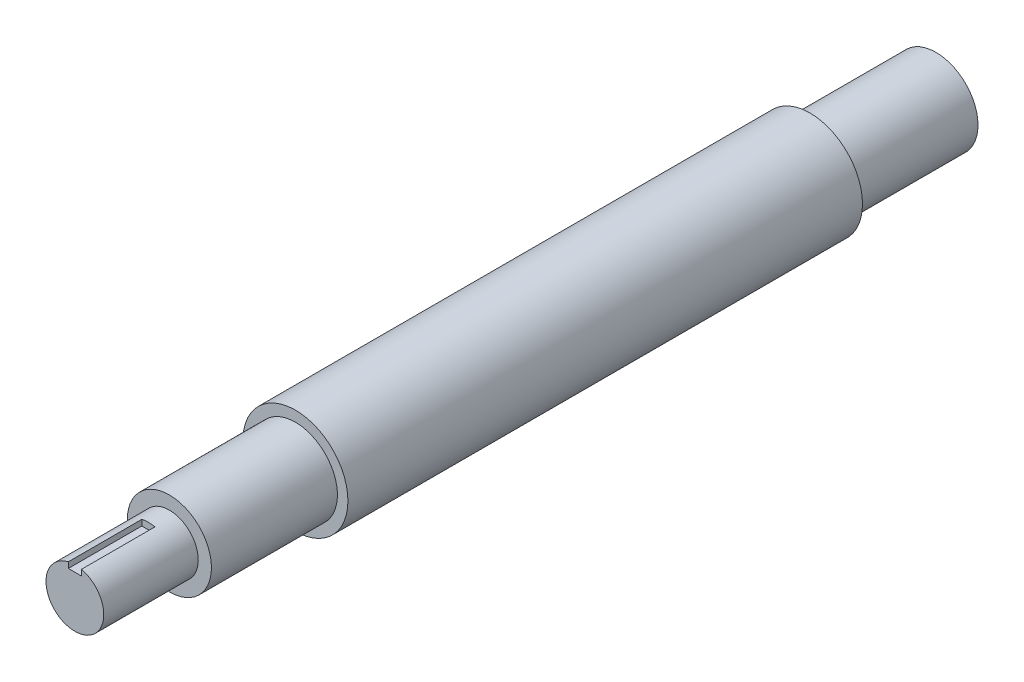
ISO-10303-21;
HEADER;
FILE_DESCRIPTION(('STEP AP214'),'2;1');
FILE_NAME('part.step','',(''),(''),'','','');
FILE_SCHEMA(('AUTOMOTIVE_DESIGN { 1 0 10303 214 1 1 1 1 }'));
ENDSEC;
DATA;
#1=APPLICATION_CONTEXT('core data for automotive mechanical design processes');
#2=APPLICATION_PROTOCOL_DEFINITION('international standard','automotive_design',2000,#1);
#3=PRODUCT_CONTEXT('',#1,'mechanical');
#4=PRODUCT('Part','Part','',(#3));
#5=PRODUCT_RELATED_PRODUCT_CATEGORY('part','',(#4));
#6=PRODUCT_DEFINITION_FORMATION('','',#4);
#7=PRODUCT_DEFINITION_CONTEXT('part definition',#1,'design');
#8=PRODUCT_DEFINITION('design','',#6,#7);
#9=PRODUCT_DEFINITION_SHAPE('','',#8);
#10=(LENGTH_UNIT() NAMED_UNIT(*) SI_UNIT(.MILLI.,.METRE.));
#11=(NAMED_UNIT(*) PLANE_ANGLE_UNIT() SI_UNIT($,.RADIAN.));
#12=(NAMED_UNIT(*) SI_UNIT($,.STERADIAN.) SOLID_ANGLE_UNIT());
#13=UNCERTAINTY_MEASURE_WITH_UNIT(LENGTH_MEASURE(1.E-05),#10,'distance_accuracy_value','');
#14=(GEOMETRIC_REPRESENTATION_CONTEXT(3) GLOBAL_UNCERTAINTY_ASSIGNED_CONTEXT((#13)) GLOBAL_UNIT_ASSIGNED_CONTEXT((#10,
#11,#12)) REPRESENTATION_CONTEXT('',''));
#15=CARTESIAN_POINT('',(0.,0.,0.));
#16=DIRECTION('',(0.,0.,1.));
#17=DIRECTION('',(1.,0.,0.));
#18=AXIS2_PLACEMENT_3D('',#15,#16,#17);
#19=CARTESIAN_POINT('',(0.,0.,155.575));
#20=DIRECTION('',(0.,0.,-1.));
#21=DIRECTION('',(-1.,0.,0.));
#22=AXIS2_PLACEMENT_3D('',#19,#20,#21);
#23=CYLINDRICAL_SURFACE('',#22,31.75);
#24=CARTESIAN_POINT('',(0.,0.,155.575));
#25=DIRECTION('',(0.,0.,1.));
#26=DIRECTION('',(1.,0.,0.));
#27=AXIS2_PLACEMENT_3D('',#24,#25,#26);
#28=CIRCLE('',#27,31.75);
#29=CARTESIAN_POINT('',(31.75,0.,155.575));
#30=VERTEX_POINT('',#29);
#31=EDGE_CURVE('E121',#30,#30,#28,.T.);
#32=ORIENTED_EDGE('',*,*,#31,.F.);
#33=EDGE_LOOP('',(#32));
#34=FACE_BOUND('',#33,.T.);
#35=CARTESIAN_POINT('',(0.,0.,-155.575));
#36=DIRECTION('',(0.,0.,1.));
#37=DIRECTION('',(1.,0.,0.));
#38=AXIS2_PLACEMENT_3D('',#35,#36,#37);
#39=CIRCLE('',#38,31.75);
#40=CARTESIAN_POINT('',(31.75,0.,-155.575));
#41=VERTEX_POINT('',#40);
#42=EDGE_CURVE('E118',#41,#41,#39,.T.);
#43=ORIENTED_EDGE('',*,*,#42,.T.);
#44=EDGE_LOOP('',(#43));
#45=FACE_BOUND('',#44,.T.);
#46=ADVANCED_FACE('F35',(#34,#45),#23,.T.);
#47=CARTESIAN_POINT('',(0.,0.,155.575));
#48=DIRECTION('',(0.,0.,1.));
#49=DIRECTION('',(1.,0.,0.));
#50=AXIS2_PLACEMENT_3D('',#47,#48,#49);
#51=PLANE('',#50);
#52=CARTESIAN_POINT('',(0.,0.,155.575));
#53=DIRECTION('',(0.,0.,1.));
#54=DIRECTION('',(1.,0.,0.));
#55=AXIS2_PLACEMENT_3D('',#52,#53,#54);
#56=CIRCLE('',#55,25.4);
#57=CARTESIAN_POINT('',(-25.4,0.,155.575));
#58=VERTEX_POINT('',#57);
#59=EDGE_CURVE('E115',#58,#58,#56,.T.);
#60=ORIENTED_EDGE('',*,*,#59,.F.);
#61=EDGE_LOOP('',(#60));
#62=FACE_BOUND('',#61,.T.);
#63=ORIENTED_EDGE('',*,*,#31,.T.);
#64=EDGE_LOOP('',(#63));
#65=FACE_BOUND('',#64,.T.);
#66=ADVANCED_FACE('F131',(#62,#65),#51,.T.);
#67=CARTESIAN_POINT('',(0.,0.,-155.575));
#68=DIRECTION('',(0.,0.,1.));
#69=DIRECTION('',(1.,0.,0.));
#70=AXIS2_PLACEMENT_3D('',#67,#68,#69);
#71=PLANE('',#70);
#72=CARTESIAN_POINT('',(0.,0.,-155.575));
#73=DIRECTION('',(0.,0.,-1.));
#74=DIRECTION('',(-1.,0.,0.));
#75=AXIS2_PLACEMENT_3D('',#72,#73,#74);
#76=CIRCLE('',#75,25.4);
#77=CARTESIAN_POINT('',(25.4,0.,-155.575));
#78=VERTEX_POINT('',#77);
#79=EDGE_CURVE('E109',#78,#78,#76,.T.);
#80=ORIENTED_EDGE('',*,*,#79,.F.);
#81=EDGE_LOOP('',(#80));
#82=FACE_BOUND('',#81,.T.);
#83=ORIENTED_EDGE('',*,*,#42,.F.);
#84=EDGE_LOOP('',(#83));
#85=FACE_BOUND('',#84,.T.);
#86=ADVANCED_FACE('F128',(#82,#85),#71,.F.);
#87=CARTESIAN_POINT('',(0.,0.,231.775));
#88=DIRECTION('',(0.,0.,-1.));
#89=DIRECTION('',(-1.,0.,0.));
#90=AXIS2_PLACEMENT_3D('',#87,#88,#89);
#91=CYLINDRICAL_SURFACE('',#90,25.4);
#92=CARTESIAN_POINT('',(0.,0.,231.775));
#93=DIRECTION('',(0.,0.,1.));
#94=DIRECTION('',(1.,0.,0.));
#95=AXIS2_PLACEMENT_3D('',#92,#93,#94);
#96=CIRCLE('',#95,25.4);
#97=CARTESIAN_POINT('',(-25.4,0.,231.775));
#98=VERTEX_POINT('',#97);
#99=EDGE_CURVE('E112',#98,#98,#96,.T.);
#100=CARTESIAN_POINT('',(-25.4,0.,231.775));
#101=CARTESIAN_POINT('',(-25.4,0.,230.98125));
#102=CARTESIAN_POINT('',(-25.4,0.,230.1875));
#103=CARTESIAN_POINT('',(-25.4,0.,228.6));
#104=CARTESIAN_POINT('',(-25.4,0.,227.80625));
#105=CARTESIAN_POINT('',(-25.4,0.,226.21875));
#106=CARTESIAN_POINT('',(-25.4,0.,225.425));
#107=CARTESIAN_POINT('',(-25.4,0.,223.8375));
#108=CARTESIAN_POINT('',(-25.4,0.,223.04375));
#109=CARTESIAN_POINT('',(-25.4,0.,221.45625));
#110=CARTESIAN_POINT('',(-25.4,0.,220.6625));
#111=CARTESIAN_POINT('',(-25.4,0.,219.075));
#112=CARTESIAN_POINT('',(-25.4,0.,218.28125));
#113=CARTESIAN_POINT('',(-25.4,0.,216.69375));
#114=CARTESIAN_POINT('',(-25.4,0.,215.9));
#115=CARTESIAN_POINT('',(-25.4,0.,214.3125));
#116=CARTESIAN_POINT('',(-25.4,0.,213.51875));
#117=CARTESIAN_POINT('',(-25.4,0.,211.93125));
#118=CARTESIAN_POINT('',(-25.4,0.,211.1375));
#119=CARTESIAN_POINT('',(-25.4,0.,209.55));
#120=CARTESIAN_POINT('',(-25.4,0.,208.75625));
#121=CARTESIAN_POINT('',(-25.4,0.,207.16875));
#122=CARTESIAN_POINT('',(-25.4,0.,206.375));
#123=CARTESIAN_POINT('',(-25.4,0.,204.7875));
#124=CARTESIAN_POINT('',(-25.4,0.,203.99375));
#125=CARTESIAN_POINT('',(-25.4,0.,202.40625));
#126=CARTESIAN_POINT('',(-25.4,0.,201.6125));
#127=CARTESIAN_POINT('',(-25.4,0.,200.025));
#128=CARTESIAN_POINT('',(-25.4,0.,199.23125));
#129=CARTESIAN_POINT('',(-25.4,0.,197.64375));
#130=CARTESIAN_POINT('',(-25.4,0.,196.85));
#131=CARTESIAN_POINT('',(-25.4,0.,195.2625));
#132=CARTESIAN_POINT('',(-25.4,0.,194.46875));
#133=CARTESIAN_POINT('',(-25.4,0.,192.88125));
#134=CARTESIAN_POINT('',(-25.4,0.,192.0875));
#135=CARTESIAN_POINT('',(-25.4,0.,190.5));
#136=CARTESIAN_POINT('',(-25.4,0.,189.70625));
#137=CARTESIAN_POINT('',(-25.4,0.,188.11875));
#138=CARTESIAN_POINT('',(-25.4,0.,187.325));
#139=CARTESIAN_POINT('',(-25.4,0.,185.7375));
#140=CARTESIAN_POINT('',(-25.4,0.,184.94375));
#141=CARTESIAN_POINT('',(-25.4,0.,183.35625));
#142=CARTESIAN_POINT('',(-25.4,0.,182.5625));
#143=CARTESIAN_POINT('',(-25.4,0.,180.975));
#144=CARTESIAN_POINT('',(-25.4,0.,180.18125));
#145=CARTESIAN_POINT('',(-25.4,0.,178.59375));
#146=CARTESIAN_POINT('',(-25.4,0.,177.8));
#147=CARTESIAN_POINT('',(-25.4,0.,176.2125));
#148=CARTESIAN_POINT('',(-25.4,0.,175.41875));
#149=CARTESIAN_POINT('',(-25.4,0.,173.83125));
#150=CARTESIAN_POINT('',(-25.4,0.,173.0375));
#151=CARTESIAN_POINT('',(-25.4,0.,171.45));
#152=CARTESIAN_POINT('',(-25.4,0.,170.65625));
#153=CARTESIAN_POINT('',(-25.4,0.,169.06875));
#154=CARTESIAN_POINT('',(-25.4,0.,168.275));
#155=CARTESIAN_POINT('',(-25.4,0.,166.6875));
#156=CARTESIAN_POINT('',(-25.4,0.,165.89375));
#157=CARTESIAN_POINT('',(-25.4,0.,164.30625));
#158=CARTESIAN_POINT('',(-25.4,0.,163.5125));
#159=CARTESIAN_POINT('',(-25.4,0.,161.925));
#160=CARTESIAN_POINT('',(-25.4,0.,161.13125));
#161=CARTESIAN_POINT('',(-25.4,0.,159.54375));
#162=CARTESIAN_POINT('',(-25.4,0.,158.75));
#163=CARTESIAN_POINT('',(-25.4,0.,157.1625));
#164=CARTESIAN_POINT('',(-25.4,0.,156.36875));
#165=CARTESIAN_POINT('',(-25.4,0.,155.575));
#166=B_SPLINE_CURVE_WITH_KNOTS('',3,(#100,#101,#102,#103,#104,#105,#106,#107,#108,#109,#110,
#111,#112,#113,#114,#115,#116,#117,#118,#119,#120,#121,#122,#123,#124,#125,#126,#127,#128,#129,
#130,#131,#132,#133,#134,#135,#136,#137,#138,#139,#140,#141,#142,#143,#144,#145,#146,#147,#148,
#149,#150,#151,#152,#153,#154,#155,#156,#157,#158,#159,#160,#161,#162,#163,#164,#165),
.UNSPECIFIED.,.F.,.F.,(4,2,2,2,2,2,2,2,2,2,2,2,2,2,2,2,2,2,2,2,2,2,2,2,2,2,2,2,2,2,2,2,4),(0.,
2.38124999999997,4.76249999999998,7.14374999999998,9.52499999999998,11.90625,14.2875,16.66875,
19.05,21.43125,23.8125,26.19375,28.575,30.95625,33.3375,35.71875,38.1,40.48125,42.8625,45.24375,
47.625,50.00625,52.3875,54.76875,57.15,59.53125,61.9125,64.29375,66.675,69.05625,71.4375,
73.81875,76.2),.UNSPECIFIED.);
#167=EDGE_CURVE('BSEAM130',#98,#58,#166,.T.);
#168=ORIENTED_EDGE('',*,*,#99,.F.);
#169=ORIENTED_EDGE('',*,*,#59,.T.);
#170=ORIENTED_EDGE('',*,*,#167,.T.);
#171=ORIENTED_EDGE('',*,*,#167,.F.);
#172=EDGE_LOOP('',(#168,#170,#169,#171));
#173=FACE_BOUND('',#172,.T.);
#174=ADVANCED_FACE('F130',(#173),#91,.T.);
#175=CARTESIAN_POINT('',(0.,0.,231.775));
#176=DIRECTION('',(0.,0.,1.));
#177=DIRECTION('',(1.,0.,0.));
#178=AXIS2_PLACEMENT_3D('',#175,#176,#177);
#179=PLANE('',#178);
#180=CARTESIAN_POINT('',(0.,0.,231.775));
#181=DIRECTION('',(0.,0.,1.));
#182=DIRECTION('',(1.,0.,0.));
#183=AXIS2_PLACEMENT_3D('',#180,#181,#182);
#184=CIRCLE('',#183,17.4625);
#185=CARTESIAN_POINT('',(17.4625,0.,231.775));
#186=VERTEX_POINT('',#185);
#187=EDGE_CURVE('E106',#186,#186,#184,.T.);
#188=ORIENTED_EDGE('',*,*,#187,.F.);
#189=EDGE_LOOP('',(#188));
#190=FACE_BOUND('',#189,.T.);
#191=ORIENTED_EDGE('',*,*,#99,.T.);
#192=EDGE_LOOP('',(#191));
#193=FACE_BOUND('',#192,.T.);
#194=ADVANCED_FACE('F137',(#190,#193),#179,.T.);
#195=CARTESIAN_POINT('',(0.,0.,-231.775));
#196=DIRECTION('',(0.,0.,1.));
#197=DIRECTION('',(1.,0.,0.));
#198=AXIS2_PLACEMENT_3D('',#195,#196,#197);
#199=CYLINDRICAL_SURFACE('',#198,25.4);
#200=CARTESIAN_POINT('',(0.,0.,-231.775));
#201=DIRECTION('',(0.,0.,-1.));
#202=DIRECTION('',(-1.,0.,0.));
#203=AXIS2_PLACEMENT_3D('',#200,#201,#202);
#204=CIRCLE('',#203,25.4);
#205=CARTESIAN_POINT('',(25.4,0.,-231.775));
#206=VERTEX_POINT('',#205);
#207=EDGE_CURVE('E105',#206,#206,#204,.T.);
#208=CARTESIAN_POINT('',(25.4,0.,-231.775));
#209=CARTESIAN_POINT('',(25.4,0.,-230.98125));
#210=CARTESIAN_POINT('',(25.4,0.,-230.1875));
#211=CARTESIAN_POINT('',(25.4,0.,-228.6));
#212=CARTESIAN_POINT('',(25.4,0.,-227.80625));
#213=CARTESIAN_POINT('',(25.4,0.,-226.21875));
#214=CARTESIAN_POINT('',(25.4,0.,-225.425));
#215=CARTESIAN_POINT('',(25.4,0.,-223.8375));
#216=CARTESIAN_POINT('',(25.4,0.,-223.04375));
#217=CARTESIAN_POINT('',(25.4,0.,-221.45625));
#218=CARTESIAN_POINT('',(25.4,0.,-220.6625));
#219=CARTESIAN_POINT('',(25.4,0.,-219.075));
#220=CARTESIAN_POINT('',(25.4,0.,-218.28125));
#221=CARTESIAN_POINT('',(25.4,0.,-216.69375));
#222=CARTESIAN_POINT('',(25.4,0.,-215.9));
#223=CARTESIAN_POINT('',(25.4,0.,-214.3125));
#224=CARTESIAN_POINT('',(25.4,0.,-213.51875));
#225=CARTESIAN_POINT('',(25.4,0.,-211.93125));
#226=CARTESIAN_POINT('',(25.4,0.,-211.1375));
#227=CARTESIAN_POINT('',(25.4,0.,-209.55));
#228=CARTESIAN_POINT('',(25.4,0.,-208.75625));
#229=CARTESIAN_POINT('',(25.4,0.,-207.16875));
#230=CARTESIAN_POINT('',(25.4,0.,-206.375));
#231=CARTESIAN_POINT('',(25.4,0.,-204.7875));
#232=CARTESIAN_POINT('',(25.4,0.,-203.99375));
#233=CARTESIAN_POINT('',(25.4,0.,-202.40625));
#234=CARTESIAN_POINT('',(25.4,0.,-201.6125));
#235=CARTESIAN_POINT('',(25.4,0.,-200.025));
#236=CARTESIAN_POINT('',(25.4,0.,-199.23125));
#237=CARTESIAN_POINT('',(25.4,0.,-197.64375));
#238=CARTESIAN_POINT('',(25.4,0.,-196.85));
#239=CARTESIAN_POINT('',(25.4,0.,-195.2625));
#240=CARTESIAN_POINT('',(25.4,0.,-194.46875));
#241=CARTESIAN_POINT('',(25.4,0.,-192.88125));
#242=CARTESIAN_POINT('',(25.4,0.,-192.0875));
#243=CARTESIAN_POINT('',(25.4,0.,-190.5));
#244=CARTESIAN_POINT('',(25.4,0.,-189.70625));
#245=CARTESIAN_POINT('',(25.4,0.,-188.11875));
#246=CARTESIAN_POINT('',(25.4,0.,-187.325));
#247=CARTESIAN_POINT('',(25.4,0.,-185.7375));
#248=CARTESIAN_POINT('',(25.4,0.,-184.94375));
#249=CARTESIAN_POINT('',(25.4,0.,-183.35625));
#250=CARTESIAN_POINT('',(25.4,0.,-182.5625));
#251=CARTESIAN_POINT('',(25.4,0.,-180.975));
#252=CARTESIAN_POINT('',(25.4,0.,-180.18125));
#253=CARTESIAN_POINT('',(25.4,0.,-178.59375));
#254=CARTESIAN_POINT('',(25.4,0.,-177.8));
#255=CARTESIAN_POINT('',(25.4,0.,-176.2125));
#256=CARTESIAN_POINT('',(25.4,0.,-175.41875));
#257=CARTESIAN_POINT('',(25.4,0.,-173.83125));
#258=CARTESIAN_POINT('',(25.4,0.,-173.0375));
#259=CARTESIAN_POINT('',(25.4,0.,-171.45));
#260=CARTESIAN_POINT('',(25.4,0.,-170.65625));
#261=CARTESIAN_POINT('',(25.4,0.,-169.06875));
#262=CARTESIAN_POINT('',(25.4,0.,-168.275));
#263=CARTESIAN_POINT('',(25.4,0.,-166.6875));
#264=CARTESIAN_POINT('',(25.4,0.,-165.89375));
#265=CARTESIAN_POINT('',(25.4,0.,-164.30625));
#266=CARTESIAN_POINT('',(25.4,0.,-163.5125));
#267=CARTESIAN_POINT('',(25.4,0.,-161.925));
#268=CARTESIAN_POINT('',(25.4,0.,-161.13125));
#269=CARTESIAN_POINT('',(25.4,0.,-159.54375));
#270=CARTESIAN_POINT('',(25.4,0.,-158.75));
#271=CARTESIAN_POINT('',(25.4,0.,-157.1625));
#272=CARTESIAN_POINT('',(25.4,0.,-156.36875));
#273=CARTESIAN_POINT('',(25.4,0.,-155.575));
#274=B_SPLINE_CURVE_WITH_KNOTS('',3,(#208,#209,#210,#211,#212,#213,#214,#215,#216,#217,#218,
#219,#220,#221,#222,#223,#224,#225,#226,#227,#228,#229,#230,#231,#232,#233,#234,#235,#236,#237,
#238,#239,#240,#241,#242,#243,#244,#245,#246,#247,#248,#249,#250,#251,#252,#253,#254,#255,#256,
#257,#258,#259,#260,#261,#262,#263,#264,#265,#266,#267,#268,#269,#270,#271,#272,#273),
.UNSPECIFIED.,.F.,.F.,(4,2,2,2,2,2,2,2,2,2,2,2,2,2,2,2,2,2,2,2,2,2,2,2,2,2,2,2,2,2,2,2,4),(0.,
2.38124999999997,4.76249999999998,7.14374999999998,9.52499999999998,11.90625,14.2875,16.66875,
19.05,21.43125,23.8125,26.19375,28.575,30.95625,33.3375,35.71875,38.1,40.48125,42.8625,45.24375,
47.625,50.00625,52.3875,54.76875,57.15,59.53125,61.9125,64.29375,66.675,69.05625,71.4375,
73.81875,76.2),.UNSPECIFIED.);
#275=EDGE_CURVE('BSEAM170',#206,#78,#274,.T.);
#276=ORIENTED_EDGE('',*,*,#207,.F.);
#277=ORIENTED_EDGE('',*,*,#79,.T.);
#278=ORIENTED_EDGE('',*,*,#275,.T.);
#279=ORIENTED_EDGE('',*,*,#275,.F.);
#280=EDGE_LOOP('',(#276,#278,#277,#279));
#281=FACE_BOUND('',#280,.T.);
#282=ADVANCED_FACE('F170',(#281),#199,.T.);
#283=CARTESIAN_POINT('',(0.,0.,-231.775));
#284=DIRECTION('',(0.,0.,-1.));
#285=DIRECTION('',(-1.,0.,0.));
#286=AXIS2_PLACEMENT_3D('',#283,#284,#285);
#287=PLANE('',#286);
#288=ORIENTED_EDGE('',*,*,#207,.T.);
#289=EDGE_LOOP('',(#288));
#290=FACE_BOUND('',#289,.T.);
#291=ADVANCED_FACE('F175',(#290),#287,.T.);
#292=CARTESIAN_POINT('',(0.,0.,288.925));
#293=DIRECTION('',(0.,0.,-1.));
#294=DIRECTION('',(-1.,0.,0.));
#295=AXIS2_PLACEMENT_3D('',#292,#293,#294);
#296=CYLINDRICAL_SURFACE('',#295,17.4625);
#297=CARTESIAN_POINT('',(0.,0.,244.475));
#298=DIRECTION('',(0.,0.,-1.));
#299=DIRECTION('',(-1.,0.,0.));
#300=AXIS2_PLACEMENT_3D('',#297,#298,#299);
#301=CIRCLE('',#300,17.4625);
#302=CARTESIAN_POINT('',(-3.9624,17.0070071585215,244.475));
#303=VERTEX_POINT('',#302);
#304=CARTESIAN_POINT('',(3.9624,17.0070071585214,244.475));
#305=VERTEX_POINT('',#304);
#306=EDGE_CURVE('E11',#303,#305,#301,.T.);
#307=ORIENTED_EDGE('',*,*,#306,.T.);
#308=DIRECTION('',(0.,0.,-1.));
#309=VECTOR('',#308,1.);
#310=CARTESIAN_POINT('',(3.9624,17.0070071585214,288.925));
#311=LINE('',#310,#309);
#312=CARTESIAN_POINT('',(3.9624,17.0070071585214,288.925));
#313=VERTEX_POINT('',#312);
#314=EDGE_CURVE('E57',#305,#313,#311,.F.);
#315=ORIENTED_EDGE('',*,*,#314,.T.);
#316=CARTESIAN_POINT('',(0.,0.,288.925));
#317=DIRECTION('',(0.,0.,1.));
#318=DIRECTION('',(1.,0.,0.));
#319=AXIS2_PLACEMENT_3D('',#316,#317,#318);
#320=CIRCLE('',#319,17.4625);
#321=CARTESIAN_POINT('',(-3.9624,17.0070071585215,288.925));
#322=VERTEX_POINT('',#321);
#323=EDGE_CURVE('E102',#322,#313,#320,.T.);
#324=ORIENTED_EDGE('',*,*,#323,.F.);
#325=DIRECTION('',(0.,0.,-1.));
#326=VECTOR('',#325,1.);
#327=CARTESIAN_POINT('',(-3.9624,17.0070071585215,288.925));
#328=LINE('',#327,#326);
#329=EDGE_CURVE('E49',#322,#303,#328,.T.);
#330=ORIENTED_EDGE('',*,*,#329,.T.);
#331=EDGE_LOOP('',(#307,#315,#324,#330));
#332=FACE_BOUND('',#331,.T.);
#333=ORIENTED_EDGE('',*,*,#187,.T.);
#334=EDGE_LOOP('',(#333));
#335=FACE_BOUND('',#334,.T.);
#336=ADVANCED_FACE('F185',(#332,#335),#296,.T.);
#337=CARTESIAN_POINT('',(0.,0.,288.925));
#338=DIRECTION('',(0.,0.,1.));
#339=DIRECTION('',(1.,0.,0.));
#340=AXIS2_PLACEMENT_3D('',#337,#338,#339);
#341=PLANE('',#340);
#342=DIRECTION('',(0.,1.,0.));
#343=VECTOR('',#342,1.);
#344=CARTESIAN_POINT('',(3.9624,13.5001,288.925));
#345=LINE('',#344,#343);
#346=CARTESIAN_POINT('',(3.9624,13.5001,288.925));
#347=VERTEX_POINT('',#346);
#348=EDGE_CURVE('E95',#347,#313,#345,.T.);
#349=ORIENTED_EDGE('',*,*,#348,.F.);
#350=DIRECTION('',(1.,0.,0.));
#351=VECTOR('',#350,1.);
#352=CARTESIAN_POINT('',(-3.9624,13.5001,288.925));
#353=LINE('',#352,#351);
#354=CARTESIAN_POINT('',(-3.9624,13.5001,288.925));
#355=VERTEX_POINT('',#354);
#356=EDGE_CURVE('E97',#355,#347,#353,.T.);
#357=ORIENTED_EDGE('',*,*,#356,.F.);
#358=DIRECTION('',(0.,-1.,0.));
#359=VECTOR('',#358,1.);
#360=CARTESIAN_POINT('',(-3.9624,0.,288.925));
#361=LINE('',#360,#359);
#362=EDGE_CURVE('E42',#322,#355,#361,.T.);
#363=ORIENTED_EDGE('',*,*,#362,.F.);
#364=ORIENTED_EDGE('',*,*,#323,.T.);
#365=EDGE_LOOP('',(#349,#357,#363,#364));
#366=FACE_BOUND('',#365,.T.);
#367=ADVANCED_FACE('F202',(#366),#341,.T.);
#368=CARTESIAN_POINT('',(0.,0.,244.475));
#369=DIRECTION('',(0.,0.,-1.));
#370=DIRECTION('',(-1.,0.,0.));
#371=AXIS2_PLACEMENT_3D('',#368,#369,#370);
#372=PLANE('',#371);
#373=DIRECTION('',(0.,-1.,0.));
#374=VECTOR('',#373,1.);
#375=CARTESIAN_POINT('',(-3.9624,13.5001,244.475));
#376=LINE('',#375,#374);
#377=CARTESIAN_POINT('',(-3.9624,13.5001,244.475));
#378=VERTEX_POINT('',#377);
#379=EDGE_CURVE('E76',#303,#378,#376,.T.);
#380=ORIENTED_EDGE('',*,*,#379,.T.);
#381=DIRECTION('',(1.,0.,0.));
#382=VECTOR('',#381,1.);
#383=CARTESIAN_POINT('',(-3.9624,13.5001,244.475));
#384=LINE('',#383,#382);
#385=CARTESIAN_POINT('',(3.9624,13.5001,244.475));
#386=VERTEX_POINT('',#385);
#387=EDGE_CURVE('E80',#378,#386,#384,.T.);
#388=ORIENTED_EDGE('',*,*,#387,.T.);
#389=DIRECTION('',(0.,1.,0.));
#390=VECTOR('',#389,1.);
#391=CARTESIAN_POINT('',(3.9624,13.5001,244.475));
#392=LINE('',#391,#390);
#393=EDGE_CURVE('E81',#386,#305,#392,.T.);
#394=ORIENTED_EDGE('',*,*,#393,.T.);
#395=ORIENTED_EDGE('',*,*,#306,.F.);
#396=EDGE_LOOP('',(#380,#388,#394,#395));
#397=FACE_BOUND('',#396,.T.);
#398=ADVANCED_FACE('F78',(#397),#372,.F.);
#399=CARTESIAN_POINT('',(3.9624,13.5001,244.475));
#400=DIRECTION('',(1.,0.,0.));
#401=DIRECTION('',(0.,0.,-1.));
#402=AXIS2_PLACEMENT_3D('',#399,#400,#401);
#403=PLANE('',#402);
#404=ORIENTED_EDGE('',*,*,#393,.F.);
#405=DIRECTION('',(0.,0.,1.));
#406=VECTOR('',#405,1.);
#407=CARTESIAN_POINT('',(3.9624,13.5001,244.475));
#408=LINE('',#407,#406);
#409=EDGE_CURVE('E89',#386,#347,#408,.T.);
#410=ORIENTED_EDGE('',*,*,#409,.T.);
#411=ORIENTED_EDGE('',*,*,#348,.T.);
#412=ORIENTED_EDGE('',*,*,#314,.F.);
#413=EDGE_LOOP('',(#404,#410,#411,#412));
#414=FACE_BOUND('',#413,.T.);
#415=ADVANCED_FACE('F221',(#414),#403,.F.);
#416=CARTESIAN_POINT('',(-3.9624,13.5001,244.475));
#417=DIRECTION('',(-1.,0.,0.));
#418=DIRECTION('',(0.,0.,1.));
#419=AXIS2_PLACEMENT_3D('',#416,#417,#418);
#420=PLANE('',#419);
#421=ORIENTED_EDGE('',*,*,#362,.T.);
#422=DIRECTION('',(0.,0.,1.));
#423=VECTOR('',#422,1.);
#424=CARTESIAN_POINT('',(-3.9624,13.5001,244.475));
#425=LINE('',#424,#423);
#426=EDGE_CURVE('E84',#378,#355,#425,.T.);
#427=ORIENTED_EDGE('',*,*,#426,.F.);
#428=ORIENTED_EDGE('',*,*,#379,.F.);
#429=ORIENTED_EDGE('',*,*,#329,.F.);
#430=EDGE_LOOP('',(#421,#427,#428,#429));
#431=FACE_BOUND('',#430,.T.);
#432=ADVANCED_FACE('F85',(#431),#420,.F.);
#433=CARTESIAN_POINT('',(-3.9624,13.5001,244.475));
#434=DIRECTION('',(0.,-1.,0.));
#435=DIRECTION('',(0.,0.,-1.));
#436=AXIS2_PLACEMENT_3D('',#433,#434,#435);
#437=PLANE('',#436);
#438=ORIENTED_EDGE('',*,*,#356,.T.);
#439=ORIENTED_EDGE('',*,*,#409,.F.);
#440=ORIENTED_EDGE('',*,*,#387,.F.);
#441=ORIENTED_EDGE('',*,*,#426,.T.);
#442=EDGE_LOOP('',(#438,#439,#440,#441));
#443=FACE_BOUND('',#442,.T.);
#444=ADVANCED_FACE('F91',(#443),#437,.F.);
#445=CLOSED_SHELL('',(#46,#66,#86,#174,#194,#282,#291,#336,#367,#398,#415,#432,#444));
#446=MANIFOLD_SOLID_BREP('B2',#445);
#447=ADVANCED_BREP_SHAPE_REPRESENTATION('',(#18,#446),#14);
#448=SHAPE_DEFINITION_REPRESENTATION(#9,#447);
ENDSEC;
END-ISO-10303-21;
